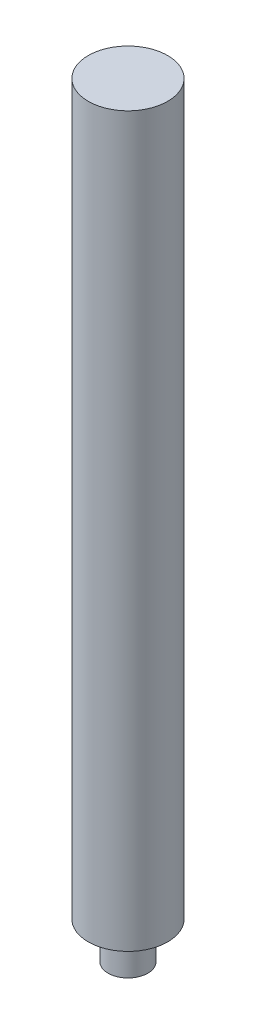
ISO-10303-21;
HEADER;
FILE_DESCRIPTION(('STEP AP214'),'2;1');
FILE_NAME('part.step','',(''),(''),'','','');
FILE_SCHEMA(('AUTOMOTIVE_DESIGN { 1 0 10303 214 1 1 1 1 }'));
ENDSEC;
DATA;
#1=APPLICATION_CONTEXT('core data for automotive mechanical design processes');
#2=APPLICATION_PROTOCOL_DEFINITION('international standard','automotive_design',2000,#1);
#3=PRODUCT_CONTEXT('',#1,'mechanical');
#4=PRODUCT('Part','Part','',(#3));
#5=PRODUCT_RELATED_PRODUCT_CATEGORY('part','',(#4));
#6=PRODUCT_DEFINITION_FORMATION('','',#4);
#7=PRODUCT_DEFINITION_CONTEXT('part definition',#1,'design');
#8=PRODUCT_DEFINITION('design','',#6,#7);
#9=PRODUCT_DEFINITION_SHAPE('','',#8);
#10=(LENGTH_UNIT() NAMED_UNIT(*) SI_UNIT(.MILLI.,.METRE.));
#11=(NAMED_UNIT(*) PLANE_ANGLE_UNIT() SI_UNIT($,.RADIAN.));
#12=(NAMED_UNIT(*) SI_UNIT($,.STERADIAN.) SOLID_ANGLE_UNIT());
#13=UNCERTAINTY_MEASURE_WITH_UNIT(LENGTH_MEASURE(1.E-05),#10,'distance_accuracy_value','');
#14=(GEOMETRIC_REPRESENTATION_CONTEXT(3) GLOBAL_UNCERTAINTY_ASSIGNED_CONTEXT((#13)) GLOBAL_UNIT_ASSIGNED_CONTEXT((#10,
#11,#12)) REPRESENTATION_CONTEXT('',''));
#15=CARTESIAN_POINT('',(0.,0.,0.));
#16=DIRECTION('',(0.,0.,1.));
#17=DIRECTION('',(1.,0.,0.));
#18=AXIS2_PLACEMENT_3D('',#15,#16,#17);
#19=CARTESIAN_POINT('',(0.,2.8,0.));
#20=DIRECTION('',(0.,-1.,0.));
#21=DIRECTION('',(0.,0.,-1.));
#22=AXIS2_PLACEMENT_3D('',#19,#20,#21);
#23=CYLINDRICAL_SURFACE('',#22,1.5);
#24=CARTESIAN_POINT('',(0.,2.8,0.));
#25=DIRECTION('',(0.,1.,0.));
#26=DIRECTION('',(0.,0.,1.));
#27=AXIS2_PLACEMENT_3D('',#24,#25,#26);
#28=CIRCLE('',#27,1.5);
#29=CARTESIAN_POINT('',(0.,2.8,1.5));
#30=VERTEX_POINT('',#29);
#31=EDGE_CURVE('E10',#30,#30,#28,.T.);
#32=ORIENTED_EDGE('',*,*,#31,.F.);
#33=EDGE_LOOP('',(#32));
#34=FACE_BOUND('',#33,.T.);
#35=CARTESIAN_POINT('',(0.,0.,0.));
#36=DIRECTION('',(0.,1.,0.));
#37=DIRECTION('',(0.,0.,1.));
#38=AXIS2_PLACEMENT_3D('',#35,#36,#37);
#39=CIRCLE('',#38,1.5);
#40=CARTESIAN_POINT('',(0.,0.,1.5));
#41=VERTEX_POINT('',#40);
#42=EDGE_CURVE('E42',#41,#41,#39,.T.);
#43=ORIENTED_EDGE('',*,*,#42,.T.);
#44=EDGE_LOOP('',(#43));
#45=FACE_BOUND('',#44,.T.);
#46=ADVANCED_FACE('F39',(#34,#45),#23,.T.);
#47=CARTESIAN_POINT('',(0.,0.,0.));
#48=DIRECTION('',(0.,1.,0.));
#49=DIRECTION('',(0.,0.,1.));
#50=AXIS2_PLACEMENT_3D('',#47,#48,#49);
#51=PLANE('',#50);
#52=ORIENTED_EDGE('',*,*,#42,.F.);
#53=EDGE_LOOP('',(#52));
#54=FACE_BOUND('',#53,.T.);
#55=ADVANCED_FACE('F66',(#54),#51,.F.);
#56=CARTESIAN_POINT('',(0.,57.8,0.));
#57=DIRECTION('',(0.,-1.,0.));
#58=DIRECTION('',(0.,0.,-1.));
#59=AXIS2_PLACEMENT_3D('',#56,#57,#58);
#60=CYLINDRICAL_SURFACE('',#59,3.);
#61=CARTESIAN_POINT('',(0.,57.8,0.));
#62=DIRECTION('',(0.,1.,0.));
#63=DIRECTION('',(0.,0.,1.));
#64=AXIS2_PLACEMENT_3D('',#61,#62,#63);
#65=CIRCLE('',#64,3.);
#66=CARTESIAN_POINT('',(0.,57.8,3.));
#67=VERTEX_POINT('',#66);
#68=EDGE_CURVE('E51',#67,#67,#65,.T.);
#69=ORIENTED_EDGE('',*,*,#68,.F.);
#70=EDGE_LOOP('',(#69));
#71=FACE_BOUND('',#70,.T.);
#72=CARTESIAN_POINT('',(0.,2.8,0.));
#73=DIRECTION('',(0.,1.,0.));
#74=DIRECTION('',(0.,0.,1.));
#75=AXIS2_PLACEMENT_3D('',#72,#73,#74);
#76=CIRCLE('',#75,3.);
#77=CARTESIAN_POINT('',(0.,2.8,3.));
#78=VERTEX_POINT('',#77);
#79=EDGE_CURVE('E53',#78,#78,#76,.T.);
#80=ORIENTED_EDGE('',*,*,#79,.T.);
#81=EDGE_LOOP('',(#80));
#82=FACE_BOUND('',#81,.T.);
#83=ADVANCED_FACE('F63',(#71,#82),#60,.T.);
#84=CARTESIAN_POINT('',(0.,57.8,0.));
#85=DIRECTION('',(0.,1.,0.));
#86=DIRECTION('',(0.,0.,1.));
#87=AXIS2_PLACEMENT_3D('',#84,#85,#86);
#88=PLANE('',#87);
#89=ORIENTED_EDGE('',*,*,#68,.T.);
#90=EDGE_LOOP('',(#89));
#91=FACE_BOUND('',#90,.T.);
#92=ADVANCED_FACE('F61',(#91),#88,.T.);
#93=CARTESIAN_POINT('',(0.,2.8,0.));
#94=DIRECTION('',(0.,1.,0.));
#95=DIRECTION('',(0.,0.,1.));
#96=AXIS2_PLACEMENT_3D('',#93,#94,#95);
#97=PLANE('',#96);
#98=ORIENTED_EDGE('',*,*,#31,.T.);
#99=EDGE_LOOP('',(#98));
#100=FACE_BOUND('',#99,.T.);
#101=ORIENTED_EDGE('',*,*,#79,.F.);
#102=EDGE_LOOP('',(#101));
#103=FACE_BOUND('',#102,.T.);
#104=ADVANCED_FACE('F70',(#100,#103),#97,.F.);
#105=CLOSED_SHELL('',(#46,#55,#83,#92,#104));
#106=MANIFOLD_SOLID_BREP('B2',#105);
#107=ADVANCED_BREP_SHAPE_REPRESENTATION('',(#18,#106),#14);
#108=SHAPE_DEFINITION_REPRESENTATION(#9,#107);
ENDSEC;
END-ISO-10303-21;
